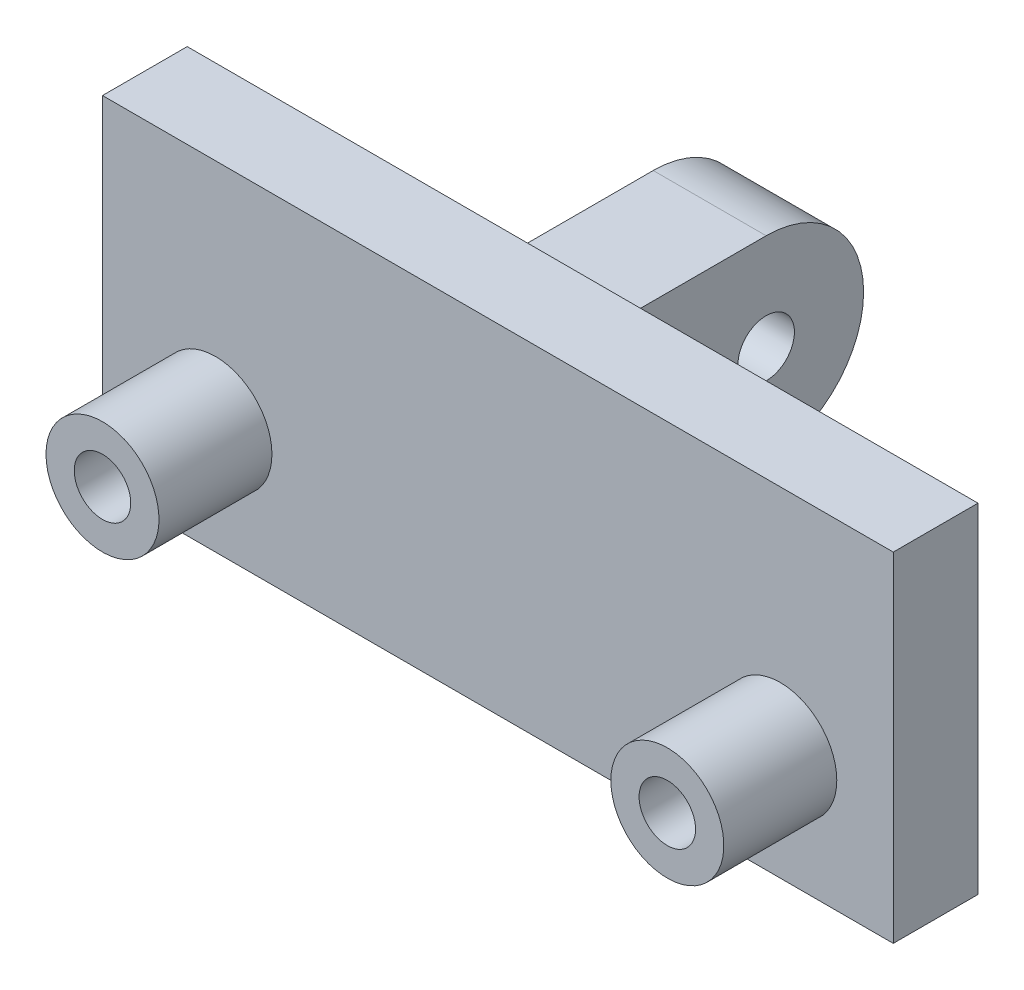
ISO-10303-21;
HEADER;
FILE_DESCRIPTION(('STEP AP214'),'2;1');
FILE_NAME('part.step','',(''),(''),'','','');
FILE_SCHEMA(('AUTOMOTIVE_DESIGN { 1 0 10303 214 1 1 1 1 }'));
ENDSEC;
DATA;
#1=APPLICATION_CONTEXT('core data for automotive mechanical design processes');
#2=APPLICATION_PROTOCOL_DEFINITION('international standard','automotive_design',2000,#1);
#3=PRODUCT_CONTEXT('',#1,'mechanical');
#4=PRODUCT('Part','Part','',(#3));
#5=PRODUCT_RELATED_PRODUCT_CATEGORY('part','',(#4));
#6=PRODUCT_DEFINITION_FORMATION('','',#4);
#7=PRODUCT_DEFINITION_CONTEXT('part definition',#1,'design');
#8=PRODUCT_DEFINITION('design','',#6,#7);
#9=PRODUCT_DEFINITION_SHAPE('','',#8);
#10=(LENGTH_UNIT() NAMED_UNIT(*) SI_UNIT(.MILLI.,.METRE.));
#11=(NAMED_UNIT(*) PLANE_ANGLE_UNIT() SI_UNIT($,.RADIAN.));
#12=(NAMED_UNIT(*) SI_UNIT($,.STERADIAN.) SOLID_ANGLE_UNIT());
#13=UNCERTAINTY_MEASURE_WITH_UNIT(LENGTH_MEASURE(1.E-05),#10,'distance_accuracy_value','');
#14=(GEOMETRIC_REPRESENTATION_CONTEXT(3) GLOBAL_UNCERTAINTY_ASSIGNED_CONTEXT((#13)) GLOBAL_UNIT_ASSIGNED_CONTEXT((#10,
#11,#12)) REPRESENTATION_CONTEXT('',''));
#15=CARTESIAN_POINT('',(0.,0.,0.));
#16=DIRECTION('',(0.,0.,1.));
#17=DIRECTION('',(1.,0.,0.));
#18=AXIS2_PLACEMENT_3D('',#15,#16,#17);
#19=CARTESIAN_POINT('',(0.,0.,0.));
#20=DIRECTION('',(0.,0.,1.));
#21=DIRECTION('',(1.,0.,0.));
#22=AXIS2_PLACEMENT_3D('',#19,#20,#21);
#23=PLANE('',#22);
#24=DIRECTION('',(0.,-1.,0.));
#25=VECTOR('',#24,1.);
#26=CARTESIAN_POINT('',(-30.4122255040452,13.3566433566434,0.));
#27=LINE('',#26,#25);
#28=CARTESIAN_POINT('',(-30.4122255040452,13.3566433566434,0.));
#29=VERTEX_POINT('',#28);
#30=CARTESIAN_POINT('',(-30.4122255040452,1.35664335664336,0.));
#31=VERTEX_POINT('',#30);
#32=EDGE_CURVE('E159',#29,#31,#27,.T.);
#33=ORIENTED_EDGE('',*,*,#32,.F.);
#34=DIRECTION('',(-1.,0.,0.));
#35=VECTOR('',#34,1.);
#36=CARTESIAN_POINT('',(-30.4122255040452,13.3566433566434,0.));
#37=LINE('',#36,#35);
#38=CARTESIAN_POINT('',(-2.41222550404521,13.3566433566434,0.));
#39=VERTEX_POINT('',#38);
#40=EDGE_CURVE('E164',#39,#29,#37,.T.);
#41=ORIENTED_EDGE('',*,*,#40,.F.);
#42=DIRECTION('',(0.,1.,0.));
#43=VECTOR('',#42,1.);
#44=CARTESIAN_POINT('',(-2.41222550404521,13.3566433566434,0.));
#45=LINE('',#44,#43);
#46=CARTESIAN_POINT('',(-2.41222550404521,1.35664335664336,0.));
#47=VERTEX_POINT('',#46);
#48=EDGE_CURVE('E175',#47,#39,#45,.T.);
#49=ORIENTED_EDGE('',*,*,#48,.F.);
#50=DIRECTION('',(1.,0.,0.));
#51=VECTOR('',#50,1.);
#52=CARTESIAN_POINT('',(-30.4122255040452,1.35664335664336,0.));
#53=LINE('',#52,#51);
#54=EDGE_CURVE('E173',#31,#47,#53,.T.);
#55=ORIENTED_EDGE('',*,*,#54,.F.);
#56=EDGE_LOOP('',(#33,#41,#49,#55));
#57=FACE_BOUND('',#56,.T.);
#58=CARTESIAN_POINT('',(-6.41222550404521,5.35664335664336,0.));
#59=DIRECTION('',(0.,0.,1.));
#60=DIRECTION('',(1.,0.,0.));
#61=AXIS2_PLACEMENT_3D('',#58,#59,#60);
#62=CIRCLE('',#61,1.);
#63=CARTESIAN_POINT('',(-5.41222550404521,5.35664335664336,0.));
#64=VERTEX_POINT('',#63);
#65=EDGE_CURVE('E151',#64,#64,#62,.T.);
#66=ORIENTED_EDGE('',*,*,#65,.T.);
#67=EDGE_LOOP('',(#66));
#68=FACE_BOUND('',#67,.T.);
#69=CARTESIAN_POINT('',(-26.4122255040452,5.35664335664336,0.));
#70=DIRECTION('',(0.,0.,1.));
#71=DIRECTION('',(1.,0.,0.));
#72=AXIS2_PLACEMENT_3D('',#69,#70,#71);
#73=CIRCLE('',#72,1.);
#74=CARTESIAN_POINT('',(-25.4122255040452,5.35664335664336,0.));
#75=VERTEX_POINT('',#74);
#76=EDGE_CURVE('E156',#75,#75,#73,.T.);
#77=ORIENTED_EDGE('',*,*,#76,.T.);
#78=EDGE_LOOP('',(#77));
#79=FACE_BOUND('',#78,.T.);
#80=DIRECTION('',(0.,-1.,0.));
#81=VECTOR('',#80,1.);
#82=CARTESIAN_POINT('',(-14.4122255040452,13.3066433566434,0.));
#83=LINE('',#82,#81);
#84=CARTESIAN_POINT('',(-14.4122255040452,13.3066433566434,0.));
#85=VERTEX_POINT('',#84);
#86=CARTESIAN_POINT('',(-14.4122255040452,6.40664335664336,0.));
#87=VERTEX_POINT('',#86);
#88=EDGE_CURVE('E112',#85,#87,#83,.T.);
#89=ORIENTED_EDGE('',*,*,#88,.F.);
#90=DIRECTION('',(-1.,0.,0.));
#91=VECTOR('',#90,1.);
#92=CARTESIAN_POINT('',(-9.91222550404521,13.3066433566434,0.));
#93=LINE('',#92,#91);
#94=CARTESIAN_POINT('',(-18.4122255040452,13.3066433566434,0.));
#95=VERTEX_POINT('',#94);
#96=EDGE_CURVE('E48',#85,#95,#93,.T.);
#97=ORIENTED_EDGE('',*,*,#96,.T.);
#98=DIRECTION('',(0.,1.,0.));
#99=VECTOR('',#98,1.);
#100=CARTESIAN_POINT('',(-18.4122255040452,6.40664335664336,0.));
#101=LINE('',#100,#99);
#102=CARTESIAN_POINT('',(-18.4122255040452,6.40664335664336,0.));
#103=VERTEX_POINT('',#102);
#104=EDGE_CURVE('E133',#103,#95,#101,.T.);
#105=ORIENTED_EDGE('',*,*,#104,.F.);
#106=DIRECTION('',(-1.,0.,0.));
#107=VECTOR('',#106,1.);
#108=CARTESIAN_POINT('',(-9.91222550404521,6.40664335664336,0.));
#109=LINE('',#108,#107);
#110=EDGE_CURVE('E55',#87,#103,#109,.T.);
#111=ORIENTED_EDGE('',*,*,#110,.F.);
#112=EDGE_LOOP('',(#89,#97,#105,#111));
#113=FACE_BOUND('',#112,.T.);
#114=ADVANCED_FACE('F33',(#57,#68,#79,#113),#23,.F.);
#115=CARTESIAN_POINT('',(-30.4122255040452,13.3566433566434,3.));
#116=DIRECTION('',(1.,0.,0.));
#117=DIRECTION('',(0.,0.,-1.));
#118=AXIS2_PLACEMENT_3D('',#115,#116,#117);
#119=PLANE('',#118);
#120=ORIENTED_EDGE('',*,*,#32,.T.);
#121=DIRECTION('',(0.,0.,-1.));
#122=VECTOR('',#121,1.);
#123=CARTESIAN_POINT('',(-30.4122255040452,1.35664335664336,3.));
#124=LINE('',#123,#122);
#125=CARTESIAN_POINT('',(-30.4122255040452,1.35664335664336,3.));
#126=VERTEX_POINT('',#125);
#127=EDGE_CURVE('E182',#126,#31,#124,.T.);
#128=ORIENTED_EDGE('',*,*,#127,.F.);
#129=DIRECTION('',(0.,-1.,0.));
#130=VECTOR('',#129,1.);
#131=CARTESIAN_POINT('',(-30.4122255040452,13.3566433566434,3.));
#132=LINE('',#131,#130);
#133=CARTESIAN_POINT('',(-30.4122255040452,13.3566433566434,3.));
#134=VERTEX_POINT('',#133);
#135=EDGE_CURVE('E160',#134,#126,#132,.T.);
#136=ORIENTED_EDGE('',*,*,#135,.F.);
#137=DIRECTION('',(0.,0.,-1.));
#138=VECTOR('',#137,1.);
#139=CARTESIAN_POINT('',(-30.4122255040452,13.3566433566434,3.));
#140=LINE('',#139,#138);
#141=EDGE_CURVE('E170',#134,#29,#140,.T.);
#142=ORIENTED_EDGE('',*,*,#141,.T.);
#143=EDGE_LOOP('',(#120,#128,#136,#142));
#144=FACE_BOUND('',#143,.T.);
#145=ADVANCED_FACE('F35',(#144),#119,.F.);
#146=CARTESIAN_POINT('',(-30.4122255040452,1.35664335664336,3.));
#147=DIRECTION('',(0.,1.,0.));
#148=DIRECTION('',(0.,0.,1.));
#149=AXIS2_PLACEMENT_3D('',#146,#147,#148);
#150=PLANE('',#149);
#151=ORIENTED_EDGE('',*,*,#54,.T.);
#152=DIRECTION('',(0.,0.,-1.));
#153=VECTOR('',#152,1.);
#154=CARTESIAN_POINT('',(-2.41222550404521,1.35664335664336,3.));
#155=LINE('',#154,#153);
#156=CARTESIAN_POINT('',(-2.41222550404521,1.35664335664336,3.));
#157=VERTEX_POINT('',#156);
#158=EDGE_CURVE('E188',#157,#47,#155,.T.);
#159=ORIENTED_EDGE('',*,*,#158,.F.);
#160=DIRECTION('',(1.,0.,0.));
#161=VECTOR('',#160,1.);
#162=CARTESIAN_POINT('',(-30.4122255040452,1.35664335664336,3.));
#163=LINE('',#162,#161);
#164=EDGE_CURVE('E163',#126,#157,#163,.T.);
#165=ORIENTED_EDGE('',*,*,#164,.F.);
#166=ORIENTED_EDGE('',*,*,#127,.T.);
#167=EDGE_LOOP('',(#151,#159,#165,#166));
#168=FACE_BOUND('',#167,.T.);
#169=ADVANCED_FACE('F209',(#168),#150,.F.);
#170=CARTESIAN_POINT('',(-2.41222550404521,13.3566433566434,3.));
#171=DIRECTION('',(-1.,0.,0.));
#172=DIRECTION('',(0.,0.,1.));
#173=AXIS2_PLACEMENT_3D('',#170,#171,#172);
#174=PLANE('',#173);
#175=ORIENTED_EDGE('',*,*,#48,.T.);
#176=DIRECTION('',(0.,0.,-1.));
#177=VECTOR('',#176,1.);
#178=CARTESIAN_POINT('',(-2.41222550404521,13.3566433566434,3.));
#179=LINE('',#178,#177);
#180=CARTESIAN_POINT('',(-2.41222550404521,13.3566433566434,3.));
#181=VERTEX_POINT('',#180);
#182=EDGE_CURVE('E192',#181,#39,#179,.T.);
#183=ORIENTED_EDGE('',*,*,#182,.F.);
#184=DIRECTION('',(0.,1.,0.));
#185=VECTOR('',#184,1.);
#186=CARTESIAN_POINT('',(-2.41222550404521,13.3566433566434,3.));
#187=LINE('',#186,#185);
#188=EDGE_CURVE('E166',#157,#181,#187,.T.);
#189=ORIENTED_EDGE('',*,*,#188,.F.);
#190=ORIENTED_EDGE('',*,*,#158,.T.);
#191=EDGE_LOOP('',(#175,#183,#189,#190));
#192=FACE_BOUND('',#191,.T.);
#193=ADVANCED_FACE('F210',(#192),#174,.F.);
#194=CARTESIAN_POINT('',(-30.4122255040452,13.3566433566434,3.));
#195=DIRECTION('',(0.,-1.,0.));
#196=DIRECTION('',(0.,0.,-1.));
#197=AXIS2_PLACEMENT_3D('',#194,#195,#196);
#198=PLANE('',#197);
#199=ORIENTED_EDGE('',*,*,#40,.T.);
#200=ORIENTED_EDGE('',*,*,#141,.F.);
#201=DIRECTION('',(-1.,0.,0.));
#202=VECTOR('',#201,1.);
#203=CARTESIAN_POINT('',(-30.4122255040452,13.3566433566434,3.));
#204=LINE('',#203,#202);
#205=EDGE_CURVE('E168',#181,#134,#204,.T.);
#206=ORIENTED_EDGE('',*,*,#205,.F.);
#207=ORIENTED_EDGE('',*,*,#182,.T.);
#208=EDGE_LOOP('',(#199,#200,#206,#207));
#209=FACE_BOUND('',#208,.T.);
#210=ADVANCED_FACE('F213',(#209),#198,.F.);
#211=CARTESIAN_POINT('',(0.,0.,3.));
#212=DIRECTION('',(0.,0.,1.));
#213=DIRECTION('',(1.,0.,0.));
#214=AXIS2_PLACEMENT_3D('',#211,#212,#213);
#215=PLANE('',#214);
#216=CARTESIAN_POINT('',(-26.4122255040452,5.35664335664336,3.));
#217=DIRECTION('',(0.,0.,1.));
#218=DIRECTION('',(1.,0.,0.));
#219=AXIS2_PLACEMENT_3D('',#216,#217,#218);
#220=CIRCLE('',#219,2.);
#221=CARTESIAN_POINT('',(-24.4122255040452,5.35664335664336,3.));
#222=VERTEX_POINT('',#221);
#223=EDGE_CURVE('E11',#222,#222,#220,.T.);
#224=ORIENTED_EDGE('',*,*,#223,.F.);
#225=EDGE_LOOP('',(#224));
#226=FACE_BOUND('',#225,.T.);
#227=CARTESIAN_POINT('',(-6.41222550404521,5.35664335664336,3.));
#228=DIRECTION('',(0.,0.,1.));
#229=DIRECTION('',(1.,0.,0.));
#230=AXIS2_PLACEMENT_3D('',#227,#228,#229);
#231=CIRCLE('',#230,2.);
#232=CARTESIAN_POINT('',(-4.41222550404521,5.35664335664336,3.));
#233=VERTEX_POINT('',#232);
#234=EDGE_CURVE('E41',#233,#233,#231,.T.);
#235=ORIENTED_EDGE('',*,*,#234,.F.);
#236=EDGE_LOOP('',(#235));
#237=FACE_BOUND('',#236,.T.);
#238=ORIENTED_EDGE('',*,*,#135,.T.);
#239=ORIENTED_EDGE('',*,*,#164,.T.);
#240=ORIENTED_EDGE('',*,*,#188,.T.);
#241=ORIENTED_EDGE('',*,*,#205,.T.);
#242=EDGE_LOOP('',(#238,#239,#240,#241));
#243=FACE_BOUND('',#242,.T.);
#244=ADVANCED_FACE('F212',(#226,#237,#243),#215,.T.);
#245=CARTESIAN_POINT('',(-26.4122255040452,5.35664335664336,0.));
#246=DIRECTION('',(0.,0.,1.));
#247=DIRECTION('',(1.,0.,0.));
#248=AXIS2_PLACEMENT_3D('',#245,#246,#247);
#249=CYLINDRICAL_SURFACE('',#248,1.);
#250=ORIENTED_EDGE('',*,*,#76,.F.);
#251=EDGE_LOOP('',(#250));
#252=FACE_BOUND('',#251,.T.);
#253=CARTESIAN_POINT('',(-26.4122255040452,5.35664335664336,7.));
#254=DIRECTION('',(0.,0.,-1.));
#255=DIRECTION('',(-1.,0.,0.));
#256=AXIS2_PLACEMENT_3D('',#253,#254,#255);
#257=CIRCLE('',#256,0.999999999999998);
#258=CARTESIAN_POINT('',(-27.4122255040452,5.35664335664336,7.));
#259=VERTEX_POINT('',#258);
#260=EDGE_CURVE('E138',#259,#259,#257,.T.);
#261=ORIENTED_EDGE('',*,*,#260,.F.);
#262=EDGE_LOOP('',(#261));
#263=FACE_BOUND('',#262,.T.);
#264=ADVANCED_FACE('F220',(#252,#263),#249,.F.);
#265=CARTESIAN_POINT('',(-6.41222550404521,5.35664335664336,0.));
#266=DIRECTION('',(0.,0.,1.));
#267=DIRECTION('',(1.,0.,0.));
#268=AXIS2_PLACEMENT_3D('',#265,#266,#267);
#269=CYLINDRICAL_SURFACE('',#268,1.);
#270=ORIENTED_EDGE('',*,*,#65,.F.);
#271=EDGE_LOOP('',(#270));
#272=FACE_BOUND('',#271,.T.);
#273=CARTESIAN_POINT('',(-6.41222550404521,5.35664335664336,7.));
#274=DIRECTION('',(0.,0.,-1.));
#275=DIRECTION('',(-1.,0.,0.));
#276=AXIS2_PLACEMENT_3D('',#273,#274,#275);
#277=CIRCLE('',#276,1.);
#278=CARTESIAN_POINT('',(-7.41222550404521,5.35664335664336,7.));
#279=VERTEX_POINT('',#278);
#280=EDGE_CURVE('E144',#279,#279,#277,.T.);
#281=ORIENTED_EDGE('',*,*,#280,.F.);
#282=EDGE_LOOP('',(#281));
#283=FACE_BOUND('',#282,.T.);
#284=ADVANCED_FACE('F232',(#272,#283),#269,.F.);
#285=CARTESIAN_POINT('',(-14.9122255040452,9.85664335664336,-4.5));
#286=DIRECTION('',(-1.,0.,0.));
#287=DIRECTION('',(0.,0.,1.));
#288=AXIS2_PLACEMENT_3D('',#285,#286,#287);
#289=CYLINDRICAL_SURFACE('',#288,1.);
#290=CARTESIAN_POINT('',(-18.4122255040452,9.85664335664336,-4.5));
#291=DIRECTION('',(-1.,0.,0.));
#292=DIRECTION('',(0.,0.,1.));
#293=AXIS2_PLACEMENT_3D('',#290,#291,#292);
#294=CIRCLE('',#293,1.);
#295=CARTESIAN_POINT('',(-18.4122255040452,9.85664335664336,-3.5));
#296=VERTEX_POINT('',#295);
#297=EDGE_CURVE('E126',#296,#296,#294,.T.);
#298=ORIENTED_EDGE('',*,*,#297,.T.);
#299=EDGE_LOOP('',(#298));
#300=FACE_BOUND('',#299,.T.);
#301=CARTESIAN_POINT('',(-14.4122255040452,9.85664335664336,-4.5));
#302=DIRECTION('',(1.,0.,0.));
#303=DIRECTION('',(0.,0.,-1.));
#304=AXIS2_PLACEMENT_3D('',#301,#302,#303);
#305=CIRCLE('',#304,0.999999999999998);
#306=CARTESIAN_POINT('',(-14.4122255040452,9.85664335664336,-5.5));
#307=VERTEX_POINT('',#306);
#308=EDGE_CURVE('E119',#307,#307,#305,.T.);
#309=ORIENTED_EDGE('',*,*,#308,.T.);
#310=EDGE_LOOP('',(#309));
#311=FACE_BOUND('',#310,.T.);
#312=ADVANCED_FACE('F236',(#300,#311),#289,.F.);
#313=CARTESIAN_POINT('',(-9.91222550404521,9.85664335664336,-4.5));
#314=DIRECTION('',(-1.,0.,0.));
#315=DIRECTION('',(0.,0.,1.));
#316=AXIS2_PLACEMENT_3D('',#313,#314,#315);
#317=CYLINDRICAL_SURFACE('',#316,3.45);
#318=DIRECTION('',(-1.,0.,0.));
#319=VECTOR('',#318,1.);
#320=CARTESIAN_POINT('',(-9.91222550404521,6.40664335664336,-4.5));
#321=LINE('',#320,#319);
#322=CARTESIAN_POINT('',(-14.4122255040452,6.40664335664336,-4.50000000000004));
#323=VERTEX_POINT('',#322);
#324=CARTESIAN_POINT('',(-18.4122255040452,6.40664335664336,-4.5));
#325=VERTEX_POINT('',#324);
#326=EDGE_CURVE('E149',#323,#325,#321,.T.);
#327=ORIENTED_EDGE('',*,*,#326,.T.);
#328=CARTESIAN_POINT('',(-18.4122255040452,9.85664335664336,-4.5));
#329=DIRECTION('',(-1.,0.,0.));
#330=DIRECTION('',(0.,0.,-1.));
#331=AXIS2_PLACEMENT_3D('',#328,#329,#330);
#332=CIRCLE('',#331,3.45);
#333=CARTESIAN_POINT('',(-18.4122255040452,13.3066433566434,-4.5));
#334=VERTEX_POINT('',#333);
#335=EDGE_CURVE('E104',#334,#325,#332,.T.);
#336=ORIENTED_EDGE('',*,*,#335,.F.);
#337=DIRECTION('',(-1.,0.,0.));
#338=VECTOR('',#337,1.);
#339=CARTESIAN_POINT('',(-9.91222550404521,13.3066433566434,-4.5));
#340=LINE('',#339,#338);
#341=CARTESIAN_POINT('',(-14.4122255040452,13.3066433566434,-4.49999999999999));
#342=VERTEX_POINT('',#341);
#343=EDGE_CURVE('E99',#342,#334,#340,.T.);
#344=ORIENTED_EDGE('',*,*,#343,.F.);
#345=CARTESIAN_POINT('',(-14.4122255040452,9.85664335664336,-4.5));
#346=DIRECTION('',(1.,0.,0.));
#347=DIRECTION('',(0.,0.,1.));
#348=AXIS2_PLACEMENT_3D('',#345,#346,#347);
#349=CIRCLE('',#348,3.45);
#350=EDGE_CURVE('E102',#323,#342,#349,.T.);
#351=ORIENTED_EDGE('',*,*,#350,.F.);
#352=EDGE_LOOP('',(#327,#336,#344,#351));
#353=FACE_BOUND('',#352,.T.);
#354=ADVANCED_FACE('F100',(#353),#317,.T.);
#355=CARTESIAN_POINT('',(-9.91222550404521,6.40664335664336,-4.5));
#356=DIRECTION('',(0.,1.,0.));
#357=DIRECTION('',(0.,0.,1.));
#358=AXIS2_PLACEMENT_3D('',#355,#356,#357);
#359=PLANE('',#358);
#360=ORIENTED_EDGE('',*,*,#110,.T.);
#361=DIRECTION('',(0.,0.,1.));
#362=VECTOR('',#361,1.);
#363=CARTESIAN_POINT('',(-18.4122255040452,6.40664335664336,-4.5));
#364=LINE('',#363,#362);
#365=EDGE_CURVE('E130',#325,#103,#364,.T.);
#366=ORIENTED_EDGE('',*,*,#365,.F.);
#367=ORIENTED_EDGE('',*,*,#326,.F.);
#368=DIRECTION('',(0.,0.,-1.));
#369=VECTOR('',#368,1.);
#370=CARTESIAN_POINT('',(-14.4122255040452,6.40664335664336,0.));
#371=LINE('',#370,#369);
#372=EDGE_CURVE('E118',#87,#323,#371,.T.);
#373=ORIENTED_EDGE('',*,*,#372,.F.);
#374=EDGE_LOOP('',(#360,#366,#367,#373));
#375=FACE_BOUND('',#374,.T.);
#376=ADVANCED_FACE('F243',(#375),#359,.F.);
#377=CARTESIAN_POINT('',(-9.91222550404521,13.3066433566434,0.));
#378=DIRECTION('',(0.,-1.,0.));
#379=DIRECTION('',(0.,0.,-1.));
#380=AXIS2_PLACEMENT_3D('',#377,#378,#379);
#381=PLANE('',#380);
#382=ORIENTED_EDGE('',*,*,#343,.T.);
#383=DIRECTION('',(0.,0.,-1.));
#384=VECTOR('',#383,1.);
#385=CARTESIAN_POINT('',(-18.4122255040452,13.3066433566434,0.));
#386=LINE('',#385,#384);
#387=EDGE_CURVE('E136',#95,#334,#386,.T.);
#388=ORIENTED_EDGE('',*,*,#387,.F.);
#389=ORIENTED_EDGE('',*,*,#96,.F.);
#390=DIRECTION('',(0.,0.,1.));
#391=VECTOR('',#390,1.);
#392=CARTESIAN_POINT('',(-14.4122255040452,13.3066433566434,-4.49999999999999));
#393=LINE('',#392,#391);
#394=EDGE_CURVE('E109',#342,#85,#393,.T.);
#395=ORIENTED_EDGE('',*,*,#394,.F.);
#396=EDGE_LOOP('',(#382,#388,#389,#395));
#397=FACE_BOUND('',#396,.T.);
#398=ADVANCED_FACE('F110',(#397),#381,.F.);
#399=CARTESIAN_POINT('',(-6.41222550404521,5.35664335664336,7.));
#400=DIRECTION('',(0.,0.,-1.));
#401=DIRECTION('',(-1.,0.,0.));
#402=AXIS2_PLACEMENT_3D('',#399,#400,#401);
#403=CYLINDRICAL_SURFACE('',#402,2.);
#404=ORIENTED_EDGE('',*,*,#234,.T.);
#405=EDGE_LOOP('',(#404));
#406=FACE_BOUND('',#405,.T.);
#407=CARTESIAN_POINT('',(-6.41222550404521,5.35664335664336,7.));
#408=DIRECTION('',(0.,0.,-1.));
#409=DIRECTION('',(-1.,0.,0.));
#410=AXIS2_PLACEMENT_3D('',#407,#408,#409);
#411=CIRCLE('',#410,2.);
#412=CARTESIAN_POINT('',(-8.41222550404521,5.35664335664336,7.));
#413=VERTEX_POINT('',#412);
#414=EDGE_CURVE('E106',#413,#413,#411,.T.);
#415=ORIENTED_EDGE('',*,*,#414,.T.);
#416=EDGE_LOOP('',(#415));
#417=FACE_BOUND('',#416,.T.);
#418=ADVANCED_FACE('F246',(#406,#417),#403,.T.);
#419=CARTESIAN_POINT('',(-6.41222550404521,5.35664335664336,7.));
#420=DIRECTION('',(0.,0.,-1.));
#421=DIRECTION('',(-1.,0.,0.));
#422=AXIS2_PLACEMENT_3D('',#419,#420,#421);
#423=PLANE('',#422);
#424=ORIENTED_EDGE('',*,*,#280,.T.);
#425=EDGE_LOOP('',(#424));
#426=FACE_BOUND('',#425,.T.);
#427=ORIENTED_EDGE('',*,*,#414,.F.);
#428=EDGE_LOOP('',(#427));
#429=FACE_BOUND('',#428,.T.);
#430=ADVANCED_FACE('F252',(#426,#429),#423,.F.);
#431=CARTESIAN_POINT('',(-26.4122255040452,5.35664335664336,7.));
#432=DIRECTION('',(0.,0.,-1.));
#433=DIRECTION('',(-1.,0.,0.));
#434=AXIS2_PLACEMENT_3D('',#431,#432,#433);
#435=CYLINDRICAL_SURFACE('',#434,2.);
#436=ORIENTED_EDGE('',*,*,#223,.T.);
#437=EDGE_LOOP('',(#436));
#438=FACE_BOUND('',#437,.T.);
#439=CARTESIAN_POINT('',(-26.4122255040452,5.35664335664336,7.));
#440=DIRECTION('',(0.,0.,-1.));
#441=DIRECTION('',(-1.,0.,0.));
#442=AXIS2_PLACEMENT_3D('',#439,#440,#441);
#443=CIRCLE('',#442,2.);
#444=CARTESIAN_POINT('',(-28.4122255040452,5.35664335664336,7.));
#445=VERTEX_POINT('',#444);
#446=EDGE_CURVE('E141',#445,#445,#443,.T.);
#447=ORIENTED_EDGE('',*,*,#446,.T.);
#448=EDGE_LOOP('',(#447));
#449=FACE_BOUND('',#448,.T.);
#450=ADVANCED_FACE('F255',(#438,#449),#435,.T.);
#451=CARTESIAN_POINT('',(-26.4122255040452,5.35664335664336,7.));
#452=DIRECTION('',(0.,0.,-1.));
#453=DIRECTION('',(-1.,0.,0.));
#454=AXIS2_PLACEMENT_3D('',#451,#452,#453);
#455=PLANE('',#454);
#456=ORIENTED_EDGE('',*,*,#260,.T.);
#457=EDGE_LOOP('',(#456));
#458=FACE_BOUND('',#457,.T.);
#459=ORIENTED_EDGE('',*,*,#446,.F.);
#460=EDGE_LOOP('',(#459));
#461=FACE_BOUND('',#460,.T.);
#462=ADVANCED_FACE('F259',(#458,#461),#455,.F.);
#463=CARTESIAN_POINT('',(-18.4122255040452,9.85664335664336,-4.5));
#464=DIRECTION('',(1.,0.,0.));
#465=DIRECTION('',(0.,0.,-1.));
#466=AXIS2_PLACEMENT_3D('',#463,#464,#465);
#467=PLANE('',#466);
#468=ORIENTED_EDGE('',*,*,#335,.T.);
#469=ORIENTED_EDGE('',*,*,#365,.T.);
#470=ORIENTED_EDGE('',*,*,#104,.T.);
#471=ORIENTED_EDGE('',*,*,#387,.T.);
#472=EDGE_LOOP('',(#468,#469,#470,#471));
#473=FACE_BOUND('',#472,.T.);
#474=ORIENTED_EDGE('',*,*,#297,.F.);
#475=EDGE_LOOP('',(#474));
#476=FACE_BOUND('',#475,.T.);
#477=ADVANCED_FACE('F263',(#473,#476),#467,.F.);
#478=CARTESIAN_POINT('',(-14.4122255040452,9.85664335664336,-4.5));
#479=DIRECTION('',(-1.,0.,0.));
#480=DIRECTION('',(0.,0.,1.));
#481=AXIS2_PLACEMENT_3D('',#478,#479,#480);
#482=PLANE('',#481);
#483=ORIENTED_EDGE('',*,*,#350,.T.);
#484=ORIENTED_EDGE('',*,*,#394,.T.);
#485=ORIENTED_EDGE('',*,*,#88,.T.);
#486=ORIENTED_EDGE('',*,*,#372,.T.);
#487=EDGE_LOOP('',(#483,#484,#485,#486));
#488=FACE_BOUND('',#487,.T.);
#489=ORIENTED_EDGE('',*,*,#308,.F.);
#490=EDGE_LOOP('',(#489));
#491=FACE_BOUND('',#490,.T.);
#492=ADVANCED_FACE('F115',(#488,#491),#482,.F.);
#493=CLOSED_SHELL('',(#114,#145,#169,#193,#210,#244,#264,#284,#312,#354,#376,#398,#418,#430,
#450,#462,#477,#492));
#494=MANIFOLD_SOLID_BREP('B2',#493);
#495=ADVANCED_BREP_SHAPE_REPRESENTATION('',(#18,#494),#14);
#496=SHAPE_DEFINITION_REPRESENTATION(#9,#495);
ENDSEC;
END-ISO-10303-21;
